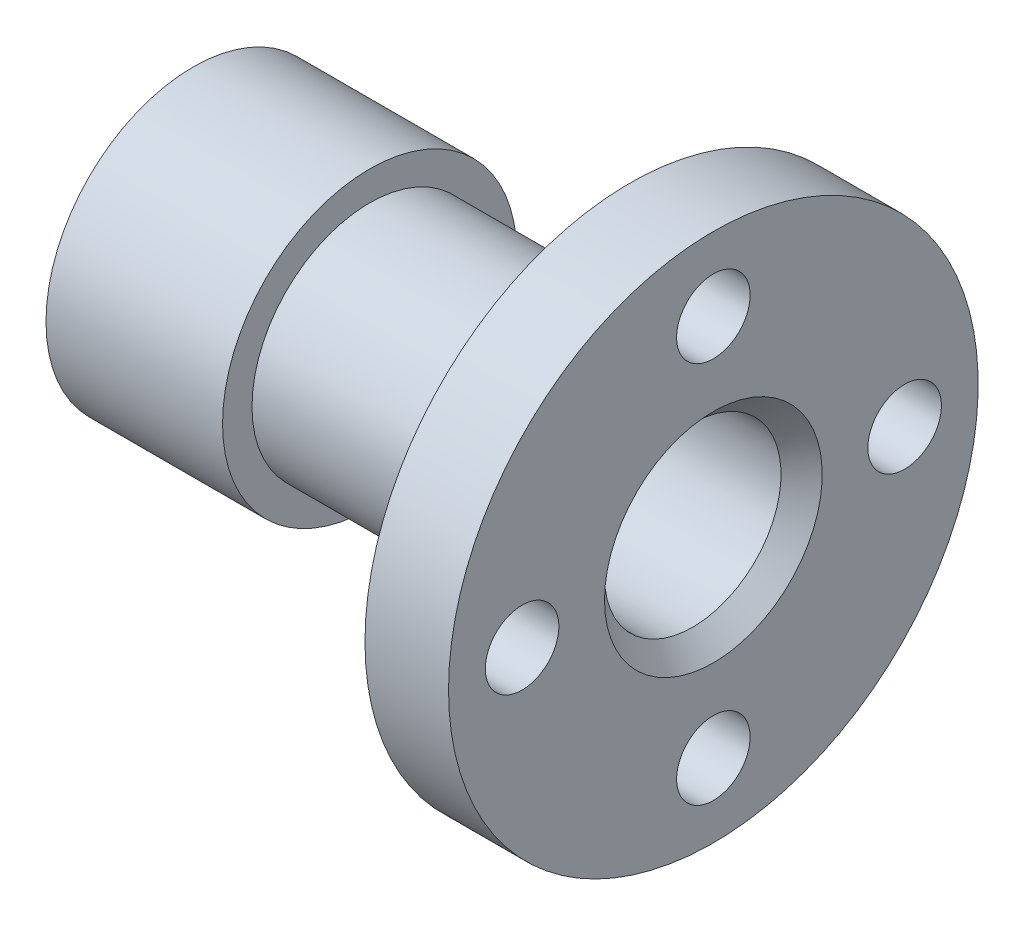
ISO-10303-21;
HEADER;
FILE_DESCRIPTION(('STEP AP214'),'2;1');
FILE_NAME('part.step','',(''),(''),'','','');
FILE_SCHEMA(('AUTOMOTIVE_DESIGN { 1 0 10303 214 1 1 1 1 }'));
ENDSEC;
DATA;
#1=APPLICATION_CONTEXT('core data for automotive mechanical design processes');
#2=APPLICATION_PROTOCOL_DEFINITION('international standard','automotive_design',2000,#1);
#3=PRODUCT_CONTEXT('',#1,'mechanical');
#4=PRODUCT('Part','Part','',(#3));
#5=PRODUCT_RELATED_PRODUCT_CATEGORY('part','',(#4));
#6=PRODUCT_DEFINITION_FORMATION('','',#4);
#7=PRODUCT_DEFINITION_CONTEXT('part definition',#1,'design');
#8=PRODUCT_DEFINITION('design','',#6,#7);
#9=PRODUCT_DEFINITION_SHAPE('','',#8);
#10=(LENGTH_UNIT() NAMED_UNIT(*) SI_UNIT(.MILLI.,.METRE.));
#11=(NAMED_UNIT(*) PLANE_ANGLE_UNIT() SI_UNIT($,.RADIAN.));
#12=(NAMED_UNIT(*) SI_UNIT($,.STERADIAN.) SOLID_ANGLE_UNIT());
#13=UNCERTAINTY_MEASURE_WITH_UNIT(LENGTH_MEASURE(1.E-05),#10,'distance_accuracy_value','');
#14=(GEOMETRIC_REPRESENTATION_CONTEXT(3) GLOBAL_UNCERTAINTY_ASSIGNED_CONTEXT((#13)) GLOBAL_UNIT_ASSIGNED_CONTEXT((#10,
#11,#12)) REPRESENTATION_CONTEXT('',''));
#15=CARTESIAN_POINT('',(0.,0.,0.));
#16=DIRECTION('',(0.,0.,1.));
#17=DIRECTION('',(1.,0.,0.));
#18=AXIS2_PLACEMENT_3D('',#15,#16,#17);
#19=CARTESIAN_POINT('',(19.7846153846154,15.,0.));
#20=DIRECTION('',(-1.,0.,0.));
#21=DIRECTION('',(0.,0.,1.));
#22=AXIS2_PLACEMENT_3D('',#19,#20,#21);
#23=PLANE('',#22);
#24=CARTESIAN_POINT('',(19.7846153846154,-32.5,0.));
#25=DIRECTION('',(-1.,0.,0.));
#26=DIRECTION('',(0.,0.,1.));
#27=AXIS2_PLACEMENT_3D('',#24,#25,#26);
#28=CIRCLE('',#27,6.25);
#29=CARTESIAN_POINT('',(19.7846153846154,-32.5,6.25));
#30=VERTEX_POINT('',#29);
#31=EDGE_CURVE('E98',#30,#30,#28,.F.);
#32=ORIENTED_EDGE('',*,*,#31,.F.);
#33=EDGE_LOOP('',(#32));
#34=FACE_BOUND('',#33,.T.);
#35=CARTESIAN_POINT('',(19.7846153846154,32.5,0.));
#36=DIRECTION('',(-1.,0.,0.));
#37=DIRECTION('',(0.,0.,1.));
#38=AXIS2_PLACEMENT_3D('',#35,#36,#37);
#39=CIRCLE('',#38,6.25);
#40=CARTESIAN_POINT('',(19.7846153846154,32.5,6.25));
#41=VERTEX_POINT('',#40);
#42=EDGE_CURVE('E106',#41,#41,#39,.T.);
#43=ORIENTED_EDGE('',*,*,#42,.T.);
#44=EDGE_LOOP('',(#43));
#45=FACE_BOUND('',#44,.T.);
#46=CARTESIAN_POINT('',(19.7846153846154,0.,-32.5));
#47=DIRECTION('',(-1.,0.,0.));
#48=DIRECTION('',(0.,0.,1.));
#49=AXIS2_PLACEMENT_3D('',#46,#47,#48);
#50=CIRCLE('',#49,6.25);
#51=CARTESIAN_POINT('',(19.7846153846154,0.,-26.25));
#52=VERTEX_POINT('',#51);
#53=EDGE_CURVE('E110',#52,#52,#50,.F.);
#54=ORIENTED_EDGE('',*,*,#53,.F.);
#55=EDGE_LOOP('',(#54));
#56=FACE_BOUND('',#55,.T.);
#57=CARTESIAN_POINT('',(19.7846153846154,0.,0.));
#58=DIRECTION('',(-1.,0.,0.));
#59=DIRECTION('',(0.,0.,1.));
#60=AXIS2_PLACEMENT_3D('',#57,#58,#59);
#61=CIRCLE('',#60,18.5);
#62=CARTESIAN_POINT('',(19.7846153846154,0.,18.5));
#63=VERTEX_POINT('',#62);
#64=EDGE_CURVE('E54',#63,#63,#61,.T.);
#65=ORIENTED_EDGE('',*,*,#64,.T.);
#66=EDGE_LOOP('',(#65));
#67=FACE_BOUND('',#66,.T.);
#68=CARTESIAN_POINT('',(19.7846153846154,0.,0.));
#69=DIRECTION('',(-1.,0.,0.));
#70=DIRECTION('',(0.,0.,1.));
#71=AXIS2_PLACEMENT_3D('',#68,#69,#70);
#72=CIRCLE('',#71,45.);
#73=CARTESIAN_POINT('',(19.7846153846154,0.,45.));
#74=VERTEX_POINT('',#73);
#75=EDGE_CURVE('E59',#74,#74,#72,.T.);
#76=ORIENTED_EDGE('',*,*,#75,.F.);
#77=EDGE_LOOP('',(#76));
#78=FACE_BOUND('',#77,.T.);
#79=CARTESIAN_POINT('',(19.7846153846154,0.,32.5));
#80=DIRECTION('',(-1.,0.,0.));
#81=DIRECTION('',(0.,0.,1.));
#82=AXIS2_PLACEMENT_3D('',#79,#80,#81);
#83=CIRCLE('',#82,6.25);
#84=CARTESIAN_POINT('',(19.7846153846154,0.,38.75));
#85=VERTEX_POINT('',#84);
#86=EDGE_CURVE('E102',#85,#85,#83,.T.);
#87=ORIENTED_EDGE('',*,*,#86,.T.);
#88=EDGE_LOOP('',(#87));
#89=FACE_BOUND('',#88,.T.);
#90=ADVANCED_FACE('F45',(#34,#45,#56,#67,#78,#89),#23,.F.);
#91=CARTESIAN_POINT('',(5.58461538461539,45.,0.));
#92=DIRECTION('',(1.,0.,0.));
#93=DIRECTION('',(0.,0.,-1.));
#94=AXIS2_PLACEMENT_3D('',#91,#92,#93);
#95=PLANE('',#94);
#96=CARTESIAN_POINT('',(5.58461538461539,-32.5,0.));
#97=DIRECTION('',(1.,0.,0.));
#98=DIRECTION('',(0.,0.,-1.));
#99=AXIS2_PLACEMENT_3D('',#96,#97,#98);
#100=CIRCLE('',#99,6.25);
#101=CARTESIAN_POINT('',(5.58461538461539,-32.5,-6.25));
#102=VERTEX_POINT('',#101);
#103=EDGE_CURVE('E114',#102,#102,#100,.T.);
#104=ORIENTED_EDGE('',*,*,#103,.T.);
#105=EDGE_LOOP('',(#104));
#106=FACE_BOUND('',#105,.T.);
#107=CARTESIAN_POINT('',(5.58461538461539,32.5,0.));
#108=DIRECTION('',(-1.,0.,0.));
#109=DIRECTION('',(0.,0.,1.));
#110=AXIS2_PLACEMENT_3D('',#107,#108,#109);
#111=CIRCLE('',#110,6.25);
#112=CARTESIAN_POINT('',(5.58461538461539,32.5,6.25));
#113=VERTEX_POINT('',#112);
#114=EDGE_CURVE('E119',#113,#113,#111,.T.);
#115=ORIENTED_EDGE('',*,*,#114,.F.);
#116=EDGE_LOOP('',(#115));
#117=FACE_BOUND('',#116,.T.);
#118=CARTESIAN_POINT('',(5.58461538461539,0.,-32.5));
#119=DIRECTION('',(1.,0.,0.));
#120=DIRECTION('',(0.,0.,-1.));
#121=AXIS2_PLACEMENT_3D('',#118,#119,#120);
#122=CIRCLE('',#121,6.25);
#123=CARTESIAN_POINT('',(5.58461538461539,0.,-38.75));
#124=VERTEX_POINT('',#123);
#125=EDGE_CURVE('E115',#124,#124,#122,.T.);
#126=ORIENTED_EDGE('',*,*,#125,.T.);
#127=EDGE_LOOP('',(#126));
#128=FACE_BOUND('',#127,.T.);
#129=CARTESIAN_POINT('',(5.5846153846154,0.,0.));
#130=DIRECTION('',(-1.,0.,0.));
#131=DIRECTION('',(0.,0.,1.));
#132=AXIS2_PLACEMENT_3D('',#129,#130,#131);
#133=CIRCLE('',#132,20.);
#134=CARTESIAN_POINT('',(5.5846153846154,0.,20.));
#135=VERTEX_POINT('',#134);
#136=EDGE_CURVE('E70',#135,#135,#133,.T.);
#137=ORIENTED_EDGE('',*,*,#136,.F.);
#138=EDGE_LOOP('',(#137));
#139=FACE_BOUND('',#138,.T.);
#140=CARTESIAN_POINT('',(5.58461538461539,0.,0.));
#141=DIRECTION('',(-1.,0.,0.));
#142=DIRECTION('',(0.,0.,1.));
#143=AXIS2_PLACEMENT_3D('',#140,#141,#142);
#144=CIRCLE('',#143,45.);
#145=CARTESIAN_POINT('',(5.58461538461539,0.,45.));
#146=VERTEX_POINT('',#145);
#147=EDGE_CURVE('E64',#146,#146,#144,.T.);
#148=ORIENTED_EDGE('',*,*,#147,.T.);
#149=EDGE_LOOP('',(#148));
#150=FACE_BOUND('',#149,.T.);
#151=CARTESIAN_POINT('',(5.58461538461539,0.,32.5));
#152=DIRECTION('',(-1.,0.,0.));
#153=DIRECTION('',(0.,0.,1.));
#154=AXIS2_PLACEMENT_3D('',#151,#152,#153);
#155=CIRCLE('',#154,6.25);
#156=CARTESIAN_POINT('',(5.58461538461539,0.,38.75));
#157=VERTEX_POINT('',#156);
#158=EDGE_CURVE('E123',#157,#157,#155,.T.);
#159=ORIENTED_EDGE('',*,*,#158,.F.);
#160=EDGE_LOOP('',(#159));
#161=FACE_BOUND('',#160,.T.);
#162=ADVANCED_FACE('F131',(#106,#117,#128,#139,#150,#161),#95,.F.);
#163=CARTESIAN_POINT('',(0.,0.,0.));
#164=DIRECTION('',(-1.,0.,0.));
#165=DIRECTION('',(0.,0.,1.));
#166=AXIS2_PLACEMENT_3D('',#163,#164,#165);
#167=CYLINDRICAL_SURFACE('',#166,45.);
#168=ORIENTED_EDGE('',*,*,#147,.F.);
#169=EDGE_LOOP('',(#168));
#170=FACE_BOUND('',#169,.T.);
#171=ORIENTED_EDGE('',*,*,#75,.T.);
#172=EDGE_LOOP('',(#171));
#173=FACE_BOUND('',#172,.T.);
#174=ADVANCED_FACE('F191',(#170,#173),#167,.T.);
#175=CARTESIAN_POINT('',(0.,0.,0.));
#176=DIRECTION('',(-1.,0.,0.));
#177=DIRECTION('',(0.,0.,1.));
#178=AXIS2_PLACEMENT_3D('',#175,#176,#177);
#179=CYLINDRICAL_SURFACE('',#178,20.);
#180=CARTESIAN_POINT('',(-38.6153846153846,0.,0.));
#181=DIRECTION('',(-1.,0.,0.));
#182=DIRECTION('',(0.,0.,1.));
#183=AXIS2_PLACEMENT_3D('',#180,#181,#182);
#184=CIRCLE('',#183,20.);
#185=CARTESIAN_POINT('',(-38.6153846153846,0.,20.));
#186=VERTEX_POINT('',#185);
#187=EDGE_CURVE('E74',#186,#186,#184,.T.);
#188=ORIENTED_EDGE('',*,*,#187,.F.);
#189=EDGE_LOOP('',(#188));
#190=FACE_BOUND('',#189,.T.);
#191=ORIENTED_EDGE('',*,*,#136,.T.);
#192=EDGE_LOOP('',(#191));
#193=FACE_BOUND('',#192,.T.);
#194=ADVANCED_FACE('F187',(#190,#193),#179,.T.);
#195=CARTESIAN_POINT('',(-38.6153846153846,25.,0.));
#196=DIRECTION('',(-1.,0.,0.));
#197=DIRECTION('',(0.,0.,1.));
#198=AXIS2_PLACEMENT_3D('',#195,#196,#197);
#199=PLANE('',#198);
#200=CARTESIAN_POINT('',(-38.6153846153846,0.,0.));
#201=DIRECTION('',(-1.,0.,0.));
#202=DIRECTION('',(0.,0.,1.));
#203=AXIS2_PLACEMENT_3D('',#200,#201,#202);
#204=CIRCLE('',#203,25.);
#205=CARTESIAN_POINT('',(-38.6153846153846,0.,25.));
#206=VERTEX_POINT('',#205);
#207=EDGE_CURVE('E78',#206,#206,#204,.T.);
#208=ORIENTED_EDGE('',*,*,#207,.F.);
#209=EDGE_LOOP('',(#208));
#210=FACE_BOUND('',#209,.T.);
#211=ORIENTED_EDGE('',*,*,#187,.T.);
#212=EDGE_LOOP('',(#211));
#213=FACE_BOUND('',#212,.T.);
#214=ADVANCED_FACE('F183',(#210,#213),#199,.F.);
#215=CARTESIAN_POINT('',(0.,0.,0.));
#216=DIRECTION('',(-1.,0.,0.));
#217=DIRECTION('',(0.,0.,1.));
#218=AXIS2_PLACEMENT_3D('',#215,#216,#217);
#219=CYLINDRICAL_SURFACE('',#218,25.);
#220=CARTESIAN_POINT('',(-68.6153846153846,0.,0.));
#221=DIRECTION('',(-1.,0.,0.));
#222=DIRECTION('',(0.,0.,1.));
#223=AXIS2_PLACEMENT_3D('',#220,#221,#222);
#224=CIRCLE('',#223,25.);
#225=CARTESIAN_POINT('',(-68.6153846153846,0.,25.));
#226=VERTEX_POINT('',#225);
#227=EDGE_CURVE('E82',#226,#226,#224,.T.);
#228=ORIENTED_EDGE('',*,*,#227,.F.);
#229=EDGE_LOOP('',(#228));
#230=FACE_BOUND('',#229,.T.);
#231=ORIENTED_EDGE('',*,*,#207,.T.);
#232=EDGE_LOOP('',(#231));
#233=FACE_BOUND('',#232,.T.);
#234=ADVANCED_FACE('F179',(#230,#233),#219,.T.);
#235=CARTESIAN_POINT('',(-68.6153846153846,19.,0.));
#236=DIRECTION('',(1.,0.,0.));
#237=DIRECTION('',(0.,0.,-1.));
#238=AXIS2_PLACEMENT_3D('',#235,#236,#237);
#239=PLANE('',#238);
#240=CARTESIAN_POINT('',(-68.6153846153846,0.,0.));
#241=DIRECTION('',(-1.,0.,0.));
#242=DIRECTION('',(0.,0.,1.));
#243=AXIS2_PLACEMENT_3D('',#240,#241,#242);
#244=CIRCLE('',#243,19.);
#245=CARTESIAN_POINT('',(-68.6153846153846,0.,19.));
#246=VERTEX_POINT('',#245);
#247=EDGE_CURVE('E86',#246,#246,#244,.T.);
#248=ORIENTED_EDGE('',*,*,#247,.F.);
#249=EDGE_LOOP('',(#248));
#250=FACE_BOUND('',#249,.T.);
#251=ORIENTED_EDGE('',*,*,#227,.T.);
#252=EDGE_LOOP('',(#251));
#253=FACE_BOUND('',#252,.T.);
#254=ADVANCED_FACE('F175',(#250,#253),#239,.F.);
#255=CARTESIAN_POINT('',(0.,0.,0.));
#256=DIRECTION('',(-1.,0.,0.));
#257=DIRECTION('',(0.,0.,1.));
#258=AXIS2_PLACEMENT_3D('',#255,#256,#257);
#259=CYLINDRICAL_SURFACE('',#258,19.);
#260=CARTESIAN_POINT('',(-44.6153846153846,0.,0.));
#261=DIRECTION('',(-1.,0.,0.));
#262=DIRECTION('',(0.,0.,1.));
#263=AXIS2_PLACEMENT_3D('',#260,#261,#262);
#264=CIRCLE('',#263,19.);
#265=CARTESIAN_POINT('',(-44.6153846153846,0.,19.));
#266=VERTEX_POINT('',#265);
#267=EDGE_CURVE('E90',#266,#266,#264,.T.);
#268=ORIENTED_EDGE('',*,*,#267,.F.);
#269=EDGE_LOOP('',(#268));
#270=FACE_BOUND('',#269,.T.);
#271=ORIENTED_EDGE('',*,*,#247,.T.);
#272=EDGE_LOOP('',(#271));
#273=FACE_BOUND('',#272,.T.);
#274=ADVANCED_FACE('F171',(#270,#273),#259,.F.);
#275=CARTESIAN_POINT('',(-44.6153846153846,15.,0.));
#276=DIRECTION('',(1.,0.,0.));
#277=DIRECTION('',(0.,0.,-1.));
#278=AXIS2_PLACEMENT_3D('',#275,#276,#277);
#279=PLANE('',#278);
#280=CARTESIAN_POINT('',(-44.6153846153846,0.,0.));
#281=DIRECTION('',(-1.,0.,0.));
#282=DIRECTION('',(0.,0.,1.));
#283=AXIS2_PLACEMENT_3D('',#280,#281,#282);
#284=CIRCLE('',#283,15.);
#285=CARTESIAN_POINT('',(-44.6153846153846,0.,15.));
#286=VERTEX_POINT('',#285);
#287=EDGE_CURVE('E94',#286,#286,#284,.T.);
#288=ORIENTED_EDGE('',*,*,#287,.F.);
#289=EDGE_LOOP('',(#288));
#290=FACE_BOUND('',#289,.T.);
#291=ORIENTED_EDGE('',*,*,#267,.T.);
#292=EDGE_LOOP('',(#291));
#293=FACE_BOUND('',#292,.T.);
#294=ADVANCED_FACE('F168',(#290,#293),#279,.F.);
#295=CARTESIAN_POINT('',(0.,0.,0.));
#296=DIRECTION('',(-1.,0.,0.));
#297=DIRECTION('',(0.,0.,1.));
#298=AXIS2_PLACEMENT_3D('',#295,#296,#297);
#299=CYLINDRICAL_SURFACE('',#298,15.);
#300=CARTESIAN_POINT('',(16.2846153846154,0.,0.));
#301=DIRECTION('',(-1.,0.,0.));
#302=DIRECTION('',(0.,0.,1.));
#303=AXIS2_PLACEMENT_3D('',#300,#301,#302);
#304=CIRCLE('',#303,15.);
#305=CARTESIAN_POINT('',(16.2846153846154,0.,15.));
#306=VERTEX_POINT('',#305);
#307=EDGE_CURVE('E10',#306,#306,#304,.F.);
#308=ORIENTED_EDGE('',*,*,#307,.T.);
#309=EDGE_LOOP('',(#308));
#310=FACE_BOUND('',#309,.T.);
#311=ORIENTED_EDGE('',*,*,#287,.T.);
#312=EDGE_LOOP('',(#311));
#313=FACE_BOUND('',#312,.T.);
#314=ADVANCED_FACE('F165',(#310,#313),#299,.F.);
#315=CARTESIAN_POINT('',(19.7846153846154,0.,0.));
#316=DIRECTION('',(1.,0.,0.));
#317=DIRECTION('',(0.,0.,-1.));
#318=AXIS2_PLACEMENT_3D('',#315,#316,#317);
#319=CONICAL_SURFACE('',#318,18.5,0.785398163397446);
#320=ORIENTED_EDGE('',*,*,#307,.F.);
#321=EDGE_LOOP('',(#320));
#322=FACE_BOUND('',#321,.T.);
#323=ORIENTED_EDGE('',*,*,#64,.F.);
#324=EDGE_LOOP('',(#323));
#325=FACE_BOUND('',#324,.T.);
#326=ADVANCED_FACE('F48',(#322,#325),#319,.F.);
#327=CARTESIAN_POINT('',(32.5846153846154,0.,-32.5));
#328=DIRECTION('',(-1.,0.,0.));
#329=DIRECTION('',(0.,0.,1.));
#330=AXIS2_PLACEMENT_3D('',#327,#328,#329);
#331=CYLINDRICAL_SURFACE('',#330,6.25);
#332=ORIENTED_EDGE('',*,*,#125,.F.);
#333=EDGE_LOOP('',(#332));
#334=FACE_BOUND('',#333,.T.);
#335=ORIENTED_EDGE('',*,*,#53,.T.);
#336=EDGE_LOOP('',(#335));
#337=FACE_BOUND('',#336,.T.);
#338=ADVANCED_FACE('F158',(#334,#337),#331,.F.);
#339=CARTESIAN_POINT('',(32.5846153846154,32.5,0.));
#340=DIRECTION('',(-1.,0.,0.));
#341=DIRECTION('',(0.,0.,1.));
#342=AXIS2_PLACEMENT_3D('',#339,#340,#341);
#343=CYLINDRICAL_SURFACE('',#342,6.25);
#344=ORIENTED_EDGE('',*,*,#114,.T.);
#345=EDGE_LOOP('',(#344));
#346=FACE_BOUND('',#345,.T.);
#347=ORIENTED_EDGE('',*,*,#42,.F.);
#348=EDGE_LOOP('',(#347));
#349=FACE_BOUND('',#348,.T.);
#350=ADVANCED_FACE('F152',(#346,#349),#343,.F.);
#351=CARTESIAN_POINT('',(32.5846153846154,0.,32.5));
#352=DIRECTION('',(-1.,0.,0.));
#353=DIRECTION('',(0.,0.,1.));
#354=AXIS2_PLACEMENT_3D('',#351,#352,#353);
#355=CYLINDRICAL_SURFACE('',#354,6.25);
#356=ORIENTED_EDGE('',*,*,#158,.T.);
#357=EDGE_LOOP('',(#356));
#358=FACE_BOUND('',#357,.T.);
#359=ORIENTED_EDGE('',*,*,#86,.F.);
#360=EDGE_LOOP('',(#359));
#361=FACE_BOUND('',#360,.T.);
#362=ADVANCED_FACE('F137',(#358,#361),#355,.F.);
#363=CARTESIAN_POINT('',(32.5846153846154,-32.5,0.));
#364=DIRECTION('',(-1.,0.,0.));
#365=DIRECTION('',(0.,0.,1.));
#366=AXIS2_PLACEMENT_3D('',#363,#364,#365);
#367=CYLINDRICAL_SURFACE('',#366,6.25);
#368=ORIENTED_EDGE('',*,*,#103,.F.);
#369=EDGE_LOOP('',(#368));
#370=FACE_BOUND('',#369,.T.);
#371=ORIENTED_EDGE('',*,*,#31,.T.);
#372=EDGE_LOOP('',(#371));
#373=FACE_BOUND('',#372,.T.);
#374=ADVANCED_FACE('F134',(#370,#373),#367,.F.);
#375=CLOSED_SHELL('',(#90,#162,#174,#194,#214,#234,#254,#274,#294,#314,#326,#338,#350,#362,#374));
#376=MANIFOLD_SOLID_BREP('B2',#375);
#377=ADVANCED_BREP_SHAPE_REPRESENTATION('',(#18,#376),#14);
#378=SHAPE_DEFINITION_REPRESENTATION(#9,#377);
ENDSEC;
END-ISO-10303-21;
